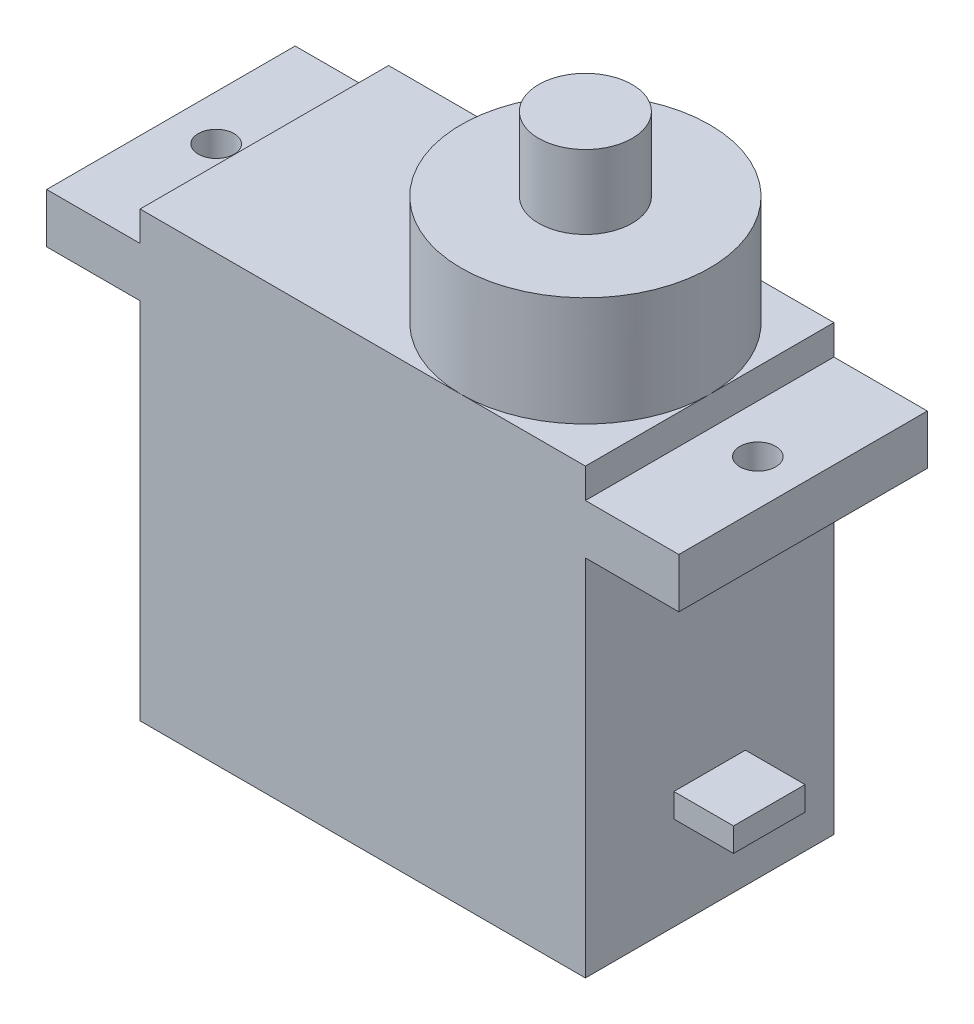
ISO-10303-21;
HEADER;
FILE_DESCRIPTION(('STEP AP214'),'2;1');
FILE_NAME('part.step','',(''),(''),'','','');
FILE_SCHEMA(('AUTOMOTIVE_DESIGN { 1 0 10303 214 1 1 1 1 }'));
ENDSEC;
DATA;
#1=APPLICATION_CONTEXT('core data for automotive mechanical design processes');
#2=APPLICATION_PROTOCOL_DEFINITION('international standard','automotive_design',2000,#1);
#3=PRODUCT_CONTEXT('',#1,'mechanical');
#4=PRODUCT('Part','Part','',(#3));
#5=PRODUCT_RELATED_PRODUCT_CATEGORY('part','',(#4));
#6=PRODUCT_DEFINITION_FORMATION('','',#4);
#7=PRODUCT_DEFINITION_CONTEXT('part definition',#1,'design');
#8=PRODUCT_DEFINITION('design','',#6,#7);
#9=PRODUCT_DEFINITION_SHAPE('','',#8);
#10=(LENGTH_UNIT() NAMED_UNIT(*) SI_UNIT(.MILLI.,.METRE.));
#11=(NAMED_UNIT(*) PLANE_ANGLE_UNIT() SI_UNIT($,.RADIAN.));
#12=(NAMED_UNIT(*) SI_UNIT($,.STERADIAN.) SOLID_ANGLE_UNIT());
#13=UNCERTAINTY_MEASURE_WITH_UNIT(LENGTH_MEASURE(1.E-05),#10,'distance_accuracy_value','');
#14=(GEOMETRIC_REPRESENTATION_CONTEXT(3) GLOBAL_UNCERTAINTY_ASSIGNED_CONTEXT((#13)) GLOBAL_UNIT_ASSIGNED_CONTEXT((#10,
#11,#12)) REPRESENTATION_CONTEXT('',''));
#15=CARTESIAN_POINT('',(0.,0.,0.));
#16=DIRECTION('',(0.,0.,1.));
#17=DIRECTION('',(1.,0.,0.));
#18=AXIS2_PLACEMENT_3D('',#15,#16,#17);
#19=CARTESIAN_POINT('',(22.4,0.,12.5));
#20=DIRECTION('',(-1.,0.,0.));
#21=DIRECTION('',(0.,0.,1.));
#22=AXIS2_PLACEMENT_3D('',#19,#20,#21);
#23=PLANE('',#22);
#24=DIRECTION('',(0.,0.,-1.));
#25=VECTOR('',#24,1.);
#26=CARTESIAN_POINT('',(22.4,18.3,12.5));
#27=LINE('',#26,#25);
#28=CARTESIAN_POINT('',(22.4,18.3,12.5));
#29=VERTEX_POINT('',#28);
#30=CARTESIAN_POINT('',(22.4,18.3,0.));
#31=VERTEX_POINT('',#30);
#32=EDGE_CURVE('E229',#29,#31,#27,.T.);
#33=ORIENTED_EDGE('',*,*,#32,.F.);
#34=DIRECTION('',(0.,1.,0.));
#35=VECTOR('',#34,1.);
#36=CARTESIAN_POINT('',(22.4,0.,12.5));
#37=LINE('',#36,#35);
#38=CARTESIAN_POINT('',(22.4,0.,12.5));
#39=VERTEX_POINT('',#38);
#40=EDGE_CURVE('E274',#39,#29,#37,.T.);
#41=ORIENTED_EDGE('',*,*,#40,.F.);
#42=DIRECTION('',(0.,0.,-1.));
#43=VECTOR('',#42,1.);
#44=CARTESIAN_POINT('',(22.4,0.,12.5));
#45=LINE('',#44,#43);
#46=CARTESIAN_POINT('',(22.4,0.,0.));
#47=VERTEX_POINT('',#46);
#48=EDGE_CURVE('E297',#39,#47,#45,.T.);
#49=ORIENTED_EDGE('',*,*,#48,.T.);
#50=DIRECTION('',(0.,1.,0.));
#51=VECTOR('',#50,1.);
#52=CARTESIAN_POINT('',(22.4,0.,0.));
#53=LINE('',#52,#51);
#54=EDGE_CURVE('E286',#47,#31,#53,.T.);
#55=ORIENTED_EDGE('',*,*,#54,.T.);
#56=EDGE_LOOP('',(#33,#41,#49,#55));
#57=FACE_BOUND('',#56,.T.);
#58=DIRECTION('',(0.,1.,0.));
#59=VECTOR('',#58,1.);
#60=CARTESIAN_POINT('',(22.4,5.9,4.45));
#61=LINE('',#60,#59);
#62=CARTESIAN_POINT('',(22.4,4.7,4.45));
#63=VERTEX_POINT('',#62);
#64=CARTESIAN_POINT('',(22.4,5.9,4.45));
#65=VERTEX_POINT('',#64);
#66=EDGE_CURVE('E184',#63,#65,#61,.T.);
#67=ORIENTED_EDGE('',*,*,#66,.F.);
#68=DIRECTION('',(0.,0.,-1.));
#69=VECTOR('',#68,1.);
#70=CARTESIAN_POINT('',(22.4,4.7,8.05));
#71=LINE('',#70,#69);
#72=CARTESIAN_POINT('',(22.4,4.7,8.05));
#73=VERTEX_POINT('',#72);
#74=EDGE_CURVE('E181',#73,#63,#71,.T.);
#75=ORIENTED_EDGE('',*,*,#74,.F.);
#76=DIRECTION('',(0.,-1.,0.));
#77=VECTOR('',#76,1.);
#78=CARTESIAN_POINT('',(22.4,5.9,8.05));
#79=LINE('',#78,#77);
#80=CARTESIAN_POINT('',(22.4,5.9,8.05));
#81=VERTEX_POINT('',#80);
#82=EDGE_CURVE('E62',#81,#73,#79,.T.);
#83=ORIENTED_EDGE('',*,*,#82,.F.);
#84=DIRECTION('',(0.,0.,1.));
#85=VECTOR('',#84,1.);
#86=CARTESIAN_POINT('',(22.4,5.9,8.05));
#87=LINE('',#86,#85);
#88=EDGE_CURVE('E57',#65,#81,#87,.T.);
#89=ORIENTED_EDGE('',*,*,#88,.F.);
#90=EDGE_LOOP('',(#67,#75,#83,#89));
#91=FACE_BOUND('',#90,.T.);
#92=ADVANCED_FACE('F40',(#57,#91),#23,.F.);
#93=CARTESIAN_POINT('',(0.,0.,12.5));
#94=DIRECTION('',(1.,0.,0.));
#95=DIRECTION('',(0.,0.,-1.));
#96=AXIS2_PLACEMENT_3D('',#93,#94,#95);
#97=PLANE('',#96);
#98=DIRECTION('',(0.,0.,-1.));
#99=VECTOR('',#98,1.);
#100=CARTESIAN_POINT('',(0.,20.8,0.));
#101=LINE('',#100,#99);
#102=CARTESIAN_POINT('',(0.,20.8,12.5));
#103=VERTEX_POINT('',#102);
#104=CARTESIAN_POINT('',(0.,20.8,0.));
#105=VERTEX_POINT('',#104);
#106=EDGE_CURVE('E207',#103,#105,#101,.T.);
#107=ORIENTED_EDGE('',*,*,#106,.F.);
#108=DIRECTION('',(0.,-1.,0.));
#109=VECTOR('',#108,1.);
#110=CARTESIAN_POINT('',(0.,0.,12.5));
#111=LINE('',#110,#109);
#112=CARTESIAN_POINT('',(0.,22.3,12.5));
#113=VERTEX_POINT('',#112);
#114=EDGE_CURVE('E267',#113,#103,#111,.T.);
#115=ORIENTED_EDGE('',*,*,#114,.F.);
#116=DIRECTION('',(0.,0.,-1.));
#117=VECTOR('',#116,1.);
#118=CARTESIAN_POINT('',(0.,22.3,12.5));
#119=LINE('',#118,#117);
#120=CARTESIAN_POINT('',(0.,22.3,0.));
#121=VERTEX_POINT('',#120);
#122=EDGE_CURVE('E280',#113,#121,#119,.T.);
#123=ORIENTED_EDGE('',*,*,#122,.T.);
#124=DIRECTION('',(0.,-1.,0.));
#125=VECTOR('',#124,1.);
#126=CARTESIAN_POINT('',(0.,0.,0.));
#127=LINE('',#126,#125);
#128=EDGE_CURVE('E281',#121,#105,#127,.T.);
#129=ORIENTED_EDGE('',*,*,#128,.T.);
#130=EDGE_LOOP('',(#107,#115,#123,#129));
#131=FACE_BOUND('',#130,.T.);
#132=ADVANCED_FACE('F42',(#131),#97,.F.);
#133=DIRECTION('',(0.,0.,1.));
#134=VECTOR('',#133,1.);
#135=CARTESIAN_POINT('',(0.,18.3,0.));
#136=LINE('',#135,#134);
#137=CARTESIAN_POINT('',(0.,18.3,0.));
#138=VERTEX_POINT('',#137);
#139=CARTESIAN_POINT('',(0.,18.3,12.5));
#140=VERTEX_POINT('',#139);
#141=EDGE_CURVE('E202',#138,#140,#136,.T.);
#142=ORIENTED_EDGE('',*,*,#141,.F.);
#143=CARTESIAN_POINT('',(0.,0.,0.));
#144=VERTEX_POINT('',#143);
#145=EDGE_CURVE('E263',#138,#144,#127,.T.);
#146=ORIENTED_EDGE('',*,*,#145,.T.);
#147=DIRECTION('',(0.,0.,-1.));
#148=VECTOR('',#147,1.);
#149=CARTESIAN_POINT('',(0.,0.,12.5));
#150=LINE('',#149,#148);
#151=CARTESIAN_POINT('',(0.,0.,12.5));
#152=VERTEX_POINT('',#151);
#153=EDGE_CURVE('E44',#152,#144,#150,.T.);
#154=ORIENTED_EDGE('',*,*,#153,.F.);
#155=EDGE_CURVE('E271',#140,#152,#111,.T.);
#156=ORIENTED_EDGE('',*,*,#155,.F.);
#157=EDGE_LOOP('',(#142,#146,#154,#156));
#158=FACE_BOUND('',#157,.T.);
#159=ADVANCED_FACE('F349',(#158),#97,.F.);
#160=DIRECTION('',(0.,0.,1.));
#161=VECTOR('',#160,1.);
#162=CARTESIAN_POINT('',(22.4,20.8,12.5));
#163=LINE('',#162,#161);
#164=CARTESIAN_POINT('',(22.4,20.8,0.));
#165=VERTEX_POINT('',#164);
#166=CARTESIAN_POINT('',(22.4,20.8,12.5));
#167=VERTEX_POINT('',#166);
#168=EDGE_CURVE('E234',#165,#167,#163,.T.);
#169=ORIENTED_EDGE('',*,*,#168,.F.);
#170=CARTESIAN_POINT('',(22.4,22.3,0.));
#171=VERTEX_POINT('',#170);
#172=EDGE_CURVE('E285',#165,#171,#53,.T.);
#173=ORIENTED_EDGE('',*,*,#172,.T.);
#174=DIRECTION('',(0.,0.,-1.));
#175=VECTOR('',#174,1.);
#176=CARTESIAN_POINT('',(22.4,22.3,12.5));
#177=LINE('',#176,#175);
#178=CARTESIAN_POINT('',(22.4,22.3,6.25));
#179=VERTEX_POINT('',#178);
#180=EDGE_CURVE('E294',#179,#171,#177,.T.);
#181=ORIENTED_EDGE('',*,*,#180,.F.);
#182=CARTESIAN_POINT('',(22.4,22.3,12.5));
#183=VERTEX_POINT('',#182);
#184=EDGE_CURVE('E295',#183,#179,#177,.T.);
#185=ORIENTED_EDGE('',*,*,#184,.F.);
#186=EDGE_CURVE('E273',#167,#183,#37,.T.);
#187=ORIENTED_EDGE('',*,*,#186,.F.);
#188=EDGE_LOOP('',(#169,#173,#181,#185,#187));
#189=FACE_BOUND('',#188,.T.);
#190=ADVANCED_FACE('F320',(#189),#23,.F.);
#191=CARTESIAN_POINT('',(0.,22.3,12.5));
#192=DIRECTION('',(0.,-1.,0.));
#193=DIRECTION('',(0.,0.,-1.));
#194=AXIS2_PLACEMENT_3D('',#191,#192,#193);
#195=PLANE('',#194);
#196=CARTESIAN_POINT('',(16.15,22.3,6.25));
#197=DIRECTION('',(0.,1.,0.));
#198=DIRECTION('',(0.,0.,1.));
#199=AXIS2_PLACEMENT_3D('',#196,#197,#198);
#200=CIRCLE('',#199,6.25);
#201=CARTESIAN_POINT('',(16.15,22.3,12.5));
#202=VERTEX_POINT('',#201);
#203=EDGE_CURVE('E258',#202,#179,#200,.T.);
#204=ORIENTED_EDGE('',*,*,#203,.F.);
#205=DIRECTION('',(-1.,0.,0.));
#206=VECTOR('',#205,1.);
#207=CARTESIAN_POINT('',(0.,22.3,12.5));
#208=LINE('',#207,#206);
#209=EDGE_CURVE('E278',#183,#202,#208,.T.);
#210=ORIENTED_EDGE('',*,*,#209,.F.);
#211=ORIENTED_EDGE('',*,*,#184,.T.);
#212=EDGE_LOOP('',(#204,#210,#211));
#213=FACE_BOUND('',#212,.T.);
#214=ADVANCED_FACE('F323',(#213),#195,.F.);
#215=CARTESIAN_POINT('',(16.15,22.3,0.));
#216=VERTEX_POINT('',#215);
#217=EDGE_CURVE('E49',#179,#216,#200,.T.);
#218=ORIENTED_EDGE('',*,*,#217,.F.);
#219=ORIENTED_EDGE('',*,*,#180,.T.);
#220=DIRECTION('',(-1.,0.,0.));
#221=VECTOR('',#220,1.);
#222=CARTESIAN_POINT('',(0.,22.3,0.));
#223=LINE('',#222,#221);
#224=EDGE_CURVE('E289',#171,#216,#223,.T.);
#225=ORIENTED_EDGE('',*,*,#224,.T.);
#226=EDGE_LOOP('',(#218,#219,#225));
#227=FACE_BOUND('',#226,.T.);
#228=ADVANCED_FACE('F315',(#227),#195,.F.);
#229=CARTESIAN_POINT('',(0.,0.,12.5));
#230=DIRECTION('',(0.,1.,0.));
#231=DIRECTION('',(0.,0.,1.));
#232=AXIS2_PLACEMENT_3D('',#229,#230,#231);
#233=PLANE('',#232);
#234=DIRECTION('',(1.,0.,0.));
#235=VECTOR('',#234,1.);
#236=CARTESIAN_POINT('',(0.,0.,0.));
#237=LINE('',#236,#235);
#238=EDGE_CURVE('E283',#144,#47,#237,.T.);
#239=ORIENTED_EDGE('',*,*,#238,.T.);
#240=ORIENTED_EDGE('',*,*,#48,.F.);
#241=DIRECTION('',(1.,0.,0.));
#242=VECTOR('',#241,1.);
#243=CARTESIAN_POINT('',(0.,0.,12.5));
#244=LINE('',#243,#242);
#245=EDGE_CURVE('E270',#152,#39,#244,.T.);
#246=ORIENTED_EDGE('',*,*,#245,.F.);
#247=ORIENTED_EDGE('',*,*,#153,.T.);
#248=EDGE_LOOP('',(#239,#240,#246,#247));
#249=FACE_BOUND('',#248,.T.);
#250=ADVANCED_FACE('F353',(#249),#233,.F.);
#251=EDGE_CURVE('E266',#216,#202,#200,.T.);
#252=ORIENTED_EDGE('',*,*,#251,.F.);
#253=EDGE_CURVE('E288',#216,#121,#223,.T.);
#254=ORIENTED_EDGE('',*,*,#253,.T.);
#255=ORIENTED_EDGE('',*,*,#122,.F.);
#256=EDGE_CURVE('E277',#202,#113,#208,.T.);
#257=ORIENTED_EDGE('',*,*,#256,.F.);
#258=EDGE_LOOP('',(#252,#254,#255,#257));
#259=FACE_BOUND('',#258,.T.);
#260=ADVANCED_FACE('F329',(#259),#195,.F.);
#261=CARTESIAN_POINT('',(0.,0.,12.5));
#262=DIRECTION('',(0.,0.,-1.));
#263=DIRECTION('',(-1.,0.,0.));
#264=AXIS2_PLACEMENT_3D('',#261,#262,#263);
#265=PLANE('',#264);
#266=ORIENTED_EDGE('',*,*,#114,.T.);
#267=DIRECTION('',(1.,0.,0.));
#268=VECTOR('',#267,1.);
#269=CARTESIAN_POINT('',(-4.7,20.8,12.5));
#270=LINE('',#269,#268);
#271=CARTESIAN_POINT('',(-4.7,20.8,12.5));
#272=VERTEX_POINT('',#271);
#273=EDGE_CURVE('E220',#272,#103,#270,.T.);
#274=ORIENTED_EDGE('',*,*,#273,.F.);
#275=DIRECTION('',(0.,1.,0.));
#276=VECTOR('',#275,1.);
#277=CARTESIAN_POINT('',(-4.7,18.3,12.5));
#278=LINE('',#277,#276);
#279=CARTESIAN_POINT('',(-4.7,18.3,12.5));
#280=VERTEX_POINT('',#279);
#281=EDGE_CURVE('E209',#280,#272,#278,.T.);
#282=ORIENTED_EDGE('',*,*,#281,.F.);
#283=DIRECTION('',(1.,0.,0.));
#284=VECTOR('',#283,1.);
#285=CARTESIAN_POINT('',(-4.7,18.3,12.5));
#286=LINE('',#285,#284);
#287=EDGE_CURVE('E223',#280,#140,#286,.T.);
#288=ORIENTED_EDGE('',*,*,#287,.T.);
#289=ORIENTED_EDGE('',*,*,#155,.T.);
#290=ORIENTED_EDGE('',*,*,#245,.T.);
#291=ORIENTED_EDGE('',*,*,#40,.T.);
#292=DIRECTION('',(-1.,0.,0.));
#293=VECTOR('',#292,1.);
#294=CARTESIAN_POINT('',(27.1,18.3,12.5));
#295=LINE('',#294,#293);
#296=CARTESIAN_POINT('',(27.1,18.3,12.5));
#297=VERTEX_POINT('',#296);
#298=EDGE_CURVE('E253',#297,#29,#295,.T.);
#299=ORIENTED_EDGE('',*,*,#298,.F.);
#300=DIRECTION('',(0.,-1.,0.));
#301=VECTOR('',#300,1.);
#302=CARTESIAN_POINT('',(27.1,18.3,12.5));
#303=LINE('',#302,#301);
#304=CARTESIAN_POINT('',(27.1,20.8,12.5));
#305=VERTEX_POINT('',#304);
#306=EDGE_CURVE('E230',#305,#297,#303,.T.);
#307=ORIENTED_EDGE('',*,*,#306,.F.);
#308=DIRECTION('',(-1.,0.,0.));
#309=VECTOR('',#308,1.);
#310=CARTESIAN_POINT('',(27.1,20.8,12.5));
#311=LINE('',#310,#309);
#312=EDGE_CURVE('E240',#305,#167,#311,.T.);
#313=ORIENTED_EDGE('',*,*,#312,.T.);
#314=ORIENTED_EDGE('',*,*,#186,.T.);
#315=ORIENTED_EDGE('',*,*,#209,.T.);
#316=ORIENTED_EDGE('',*,*,#256,.T.);
#317=EDGE_LOOP('',(#266,#274,#282,#288,#289,#290,#291,#299,#307,#313,#314,#315,#316));
#318=FACE_BOUND('',#317,.T.);
#319=ADVANCED_FACE('F326',(#318),#265,.F.);
#320=CARTESIAN_POINT('',(0.,0.,0.));
#321=DIRECTION('',(0.,0.,-1.));
#322=DIRECTION('',(-1.,0.,0.));
#323=AXIS2_PLACEMENT_3D('',#320,#321,#322);
#324=PLANE('',#323);
#325=ORIENTED_EDGE('',*,*,#128,.F.);
#326=ORIENTED_EDGE('',*,*,#253,.F.);
#327=ORIENTED_EDGE('',*,*,#224,.F.);
#328=ORIENTED_EDGE('',*,*,#172,.F.);
#329=DIRECTION('',(-1.,0.,0.));
#330=VECTOR('',#329,1.);
#331=CARTESIAN_POINT('',(27.1,20.8,0.));
#332=LINE('',#331,#330);
#333=CARTESIAN_POINT('',(27.1,20.8,0.));
#334=VERTEX_POINT('',#333);
#335=EDGE_CURVE('E247',#334,#165,#332,.T.);
#336=ORIENTED_EDGE('',*,*,#335,.F.);
#337=DIRECTION('',(0.,1.,0.));
#338=VECTOR('',#337,1.);
#339=CARTESIAN_POINT('',(27.1,18.3,0.));
#340=LINE('',#339,#338);
#341=CARTESIAN_POINT('',(27.1,18.3,0.));
#342=VERTEX_POINT('',#341);
#343=EDGE_CURVE('E236',#342,#334,#340,.T.);
#344=ORIENTED_EDGE('',*,*,#343,.F.);
#345=DIRECTION('',(-1.,0.,0.));
#346=VECTOR('',#345,1.);
#347=CARTESIAN_POINT('',(27.1,18.3,0.));
#348=LINE('',#347,#346);
#349=EDGE_CURVE('E250',#342,#31,#348,.T.);
#350=ORIENTED_EDGE('',*,*,#349,.T.);
#351=ORIENTED_EDGE('',*,*,#54,.F.);
#352=ORIENTED_EDGE('',*,*,#238,.F.);
#353=ORIENTED_EDGE('',*,*,#145,.F.);
#354=DIRECTION('',(1.,0.,0.));
#355=VECTOR('',#354,1.);
#356=CARTESIAN_POINT('',(-4.7,18.3,0.));
#357=LINE('',#356,#355);
#358=CARTESIAN_POINT('',(-4.7,18.3,0.));
#359=VERTEX_POINT('',#358);
#360=EDGE_CURVE('E226',#359,#138,#357,.T.);
#361=ORIENTED_EDGE('',*,*,#360,.F.);
#362=DIRECTION('',(0.,-1.,0.));
#363=VECTOR('',#362,1.);
#364=CARTESIAN_POINT('',(-4.7,18.3,0.));
#365=LINE('',#364,#363);
#366=CARTESIAN_POINT('',(-4.7,20.8,0.));
#367=VERTEX_POINT('',#366);
#368=EDGE_CURVE('E203',#367,#359,#365,.T.);
#369=ORIENTED_EDGE('',*,*,#368,.F.);
#370=DIRECTION('',(1.,0.,0.));
#371=VECTOR('',#370,1.);
#372=CARTESIAN_POINT('',(-4.7,20.8,0.));
#373=LINE('',#372,#371);
#374=EDGE_CURVE('E213',#367,#105,#373,.T.);
#375=ORIENTED_EDGE('',*,*,#374,.T.);
#376=EDGE_LOOP('',(#325,#326,#327,#328,#336,#344,#350,#351,#352,#353,#361,#369,#375));
#377=FACE_BOUND('',#376,.T.);
#378=ADVANCED_FACE('F352',(#377),#324,.T.);
#379=CARTESIAN_POINT('',(16.15,27.8,6.25));
#380=DIRECTION('',(0.,-1.,0.));
#381=DIRECTION('',(0.,0.,-1.));
#382=AXIS2_PLACEMENT_3D('',#379,#380,#381);
#383=CYLINDRICAL_SURFACE('',#382,6.25);
#384=CARTESIAN_POINT('',(16.15,27.8,6.25));
#385=DIRECTION('',(0.,1.,0.));
#386=DIRECTION('',(0.,0.,1.));
#387=AXIS2_PLACEMENT_3D('',#384,#385,#386);
#388=CIRCLE('',#387,6.25);
#389=CARTESIAN_POINT('',(16.15,27.8,12.5));
#390=VERTEX_POINT('',#389);
#391=EDGE_CURVE('E260',#390,#390,#388,.T.);
#392=ORIENTED_EDGE('',*,*,#391,.F.);
#393=EDGE_LOOP('',(#392));
#394=FACE_BOUND('',#393,.T.);
#395=ORIENTED_EDGE('',*,*,#203,.T.);
#396=ORIENTED_EDGE('',*,*,#217,.T.);
#397=ORIENTED_EDGE('',*,*,#251,.T.);
#398=EDGE_LOOP('',(#395,#396,#397));
#399=FACE_BOUND('',#398,.T.);
#400=ADVANCED_FACE('F310',(#394,#399),#383,.T.);
#401=CARTESIAN_POINT('',(16.15,27.8,6.25));
#402=DIRECTION('',(0.,1.,0.));
#403=DIRECTION('',(0.,0.,1.));
#404=AXIS2_PLACEMENT_3D('',#401,#402,#403);
#405=PLANE('',#404);
#406=CARTESIAN_POINT('',(16.15,27.8,6.25));
#407=DIRECTION('',(0.,1.,0.));
#408=DIRECTION('',(0.,0.,1.));
#409=AXIS2_PLACEMENT_3D('',#406,#407,#408);
#410=CIRCLE('',#409,2.35);
#411=CARTESIAN_POINT('',(16.15,27.8,8.6));
#412=VERTEX_POINT('',#411);
#413=EDGE_CURVE('E11',#412,#412,#410,.T.);
#414=ORIENTED_EDGE('',*,*,#413,.F.);
#415=EDGE_LOOP('',(#414));
#416=FACE_BOUND('',#415,.T.);
#417=ORIENTED_EDGE('',*,*,#391,.T.);
#418=EDGE_LOOP('',(#417));
#419=FACE_BOUND('',#418,.T.);
#420=ADVANCED_FACE('F432',(#416,#419),#405,.T.);
#421=CARTESIAN_POINT('',(16.15,31.5,6.25));
#422=DIRECTION('',(0.,-1.,0.));
#423=DIRECTION('',(0.,0.,-1.));
#424=AXIS2_PLACEMENT_3D('',#421,#422,#423);
#425=CYLINDRICAL_SURFACE('',#424,2.35);
#426=CARTESIAN_POINT('',(16.15,31.5,6.25));
#427=DIRECTION('',(0.,1.,0.));
#428=DIRECTION('',(0.,0.,1.));
#429=AXIS2_PLACEMENT_3D('',#426,#427,#428);
#430=CIRCLE('',#429,2.35);
#431=CARTESIAN_POINT('',(16.15,31.5,8.6));
#432=VERTEX_POINT('',#431);
#433=EDGE_CURVE('E256',#432,#432,#430,.T.);
#434=ORIENTED_EDGE('',*,*,#433,.F.);
#435=EDGE_LOOP('',(#434));
#436=FACE_BOUND('',#435,.T.);
#437=ORIENTED_EDGE('',*,*,#413,.T.);
#438=EDGE_LOOP('',(#437));
#439=FACE_BOUND('',#438,.T.);
#440=ADVANCED_FACE('F421',(#436,#439),#425,.T.);
#441=CARTESIAN_POINT('',(16.15,31.5,6.25));
#442=DIRECTION('',(0.,1.,0.));
#443=DIRECTION('',(0.,0.,1.));
#444=AXIS2_PLACEMENT_3D('',#441,#442,#443);
#445=PLANE('',#444);
#446=ORIENTED_EDGE('',*,*,#433,.T.);
#447=EDGE_LOOP('',(#446));
#448=FACE_BOUND('',#447,.T.);
#449=ADVANCED_FACE('F375',(#448),#445,.T.);
#450=CARTESIAN_POINT('',(27.1,18.3,12.5));
#451=DIRECTION('',(0.,1.,0.));
#452=DIRECTION('',(0.,0.,1.));
#453=AXIS2_PLACEMENT_3D('',#450,#451,#452);
#454=PLANE('',#453);
#455=CARTESIAN_POINT('',(24.8220091230081,18.3,6.25));
#456=DIRECTION('',(0.,1.,0.));
#457=DIRECTION('',(0.,0.,1.));
#458=AXIS2_PLACEMENT_3D('',#455,#456,#457);
#459=CIRCLE('',#458,0.9);
#460=CARTESIAN_POINT('',(24.8220091230081,18.3,7.15));
#461=VERTEX_POINT('',#460);
#462=EDGE_CURVE('E199',#461,#461,#459,.T.);
#463=ORIENTED_EDGE('',*,*,#462,.T.);
#464=EDGE_LOOP('',(#463));
#465=FACE_BOUND('',#464,.T.);
#466=ORIENTED_EDGE('',*,*,#32,.T.);
#467=ORIENTED_EDGE('',*,*,#349,.F.);
#468=DIRECTION('',(0.,0.,-1.));
#469=VECTOR('',#468,1.);
#470=CARTESIAN_POINT('',(27.1,18.3,12.5));
#471=LINE('',#470,#469);
#472=EDGE_CURVE('E233',#297,#342,#471,.T.);
#473=ORIENTED_EDGE('',*,*,#472,.F.);
#474=ORIENTED_EDGE('',*,*,#298,.T.);
#475=EDGE_LOOP('',(#466,#467,#473,#474));
#476=FACE_BOUND('',#475,.T.);
#477=ADVANCED_FACE('F357',(#465,#476),#454,.F.);
#478=CARTESIAN_POINT('',(27.1,20.8,12.5));
#479=DIRECTION('',(0.,-1.,0.));
#480=DIRECTION('',(0.,0.,-1.));
#481=AXIS2_PLACEMENT_3D('',#478,#479,#480);
#482=PLANE('',#481);
#483=CARTESIAN_POINT('',(24.8220091230081,20.8,6.25));
#484=DIRECTION('',(0.,1.,0.));
#485=DIRECTION('',(0.,0.,-1.));
#486=AXIS2_PLACEMENT_3D('',#483,#484,#485);
#487=CIRCLE('',#486,0.9);
#488=CARTESIAN_POINT('',(24.8220091230081,20.8,5.35));
#489=VERTEX_POINT('',#488);
#490=EDGE_CURVE('E185',#489,#489,#487,.T.);
#491=ORIENTED_EDGE('',*,*,#490,.F.);
#492=EDGE_LOOP('',(#491));
#493=FACE_BOUND('',#492,.T.);
#494=ORIENTED_EDGE('',*,*,#168,.T.);
#495=ORIENTED_EDGE('',*,*,#312,.F.);
#496=DIRECTION('',(0.,0.,1.));
#497=VECTOR('',#496,1.);
#498=CARTESIAN_POINT('',(27.1,20.8,12.5));
#499=LINE('',#498,#497);
#500=EDGE_CURVE('E238',#334,#305,#499,.T.);
#501=ORIENTED_EDGE('',*,*,#500,.F.);
#502=ORIENTED_EDGE('',*,*,#335,.T.);
#503=EDGE_LOOP('',(#494,#495,#501,#502));
#504=FACE_BOUND('',#503,.T.);
#505=ADVANCED_FACE('F365',(#493,#504),#482,.F.);
#506=CARTESIAN_POINT('',(27.1,0.,0.));
#507=DIRECTION('',(-1.,0.,0.));
#508=DIRECTION('',(0.,0.,1.));
#509=AXIS2_PLACEMENT_3D('',#506,#507,#508);
#510=PLANE('',#509);
#511=ORIENTED_EDGE('',*,*,#306,.T.);
#512=ORIENTED_EDGE('',*,*,#472,.T.);
#513=ORIENTED_EDGE('',*,*,#343,.T.);
#514=ORIENTED_EDGE('',*,*,#500,.T.);
#515=EDGE_LOOP('',(#511,#512,#513,#514));
#516=FACE_BOUND('',#515,.T.);
#517=ADVANCED_FACE('F361',(#516),#510,.F.);
#518=CARTESIAN_POINT('',(-4.7,18.3,0.));
#519=DIRECTION('',(0.,1.,0.));
#520=DIRECTION('',(0.,0.,1.));
#521=AXIS2_PLACEMENT_3D('',#518,#519,#520);
#522=PLANE('',#521);
#523=CARTESIAN_POINT('',(-2.42200912300813,18.3,6.25));
#524=DIRECTION('',(0.,1.,0.));
#525=DIRECTION('',(0.,0.,1.));
#526=AXIS2_PLACEMENT_3D('',#523,#524,#525);
#527=CIRCLE('',#526,0.9);
#528=CARTESIAN_POINT('',(-2.42200912300813,18.3,7.15));
#529=VERTEX_POINT('',#528);
#530=EDGE_CURVE('E195',#529,#529,#527,.T.);
#531=ORIENTED_EDGE('',*,*,#530,.T.);
#532=EDGE_LOOP('',(#531));
#533=FACE_BOUND('',#532,.T.);
#534=ORIENTED_EDGE('',*,*,#141,.T.);
#535=ORIENTED_EDGE('',*,*,#287,.F.);
#536=DIRECTION('',(0.,0.,1.));
#537=VECTOR('',#536,1.);
#538=CARTESIAN_POINT('',(-4.7,18.3,0.));
#539=LINE('',#538,#537);
#540=EDGE_CURVE('E206',#359,#280,#539,.T.);
#541=ORIENTED_EDGE('',*,*,#540,.F.);
#542=ORIENTED_EDGE('',*,*,#360,.T.);
#543=EDGE_LOOP('',(#534,#535,#541,#542));
#544=FACE_BOUND('',#543,.T.);
#545=ADVANCED_FACE('F346',(#533,#544),#522,.F.);
#546=CARTESIAN_POINT('',(-4.7,20.8,0.));
#547=DIRECTION('',(0.,-1.,0.));
#548=DIRECTION('',(0.,0.,-1.));
#549=AXIS2_PLACEMENT_3D('',#546,#547,#548);
#550=PLANE('',#549);
#551=CARTESIAN_POINT('',(-2.42200912300813,20.8,6.25));
#552=DIRECTION('',(0.,1.,0.));
#553=DIRECTION('',(0.,0.,1.));
#554=AXIS2_PLACEMENT_3D('',#551,#552,#553);
#555=CIRCLE('',#554,0.9);
#556=CARTESIAN_POINT('',(-2.42200912300813,20.8,7.15));
#557=VERTEX_POINT('',#556);
#558=EDGE_CURVE('E188',#557,#557,#555,.T.);
#559=ORIENTED_EDGE('',*,*,#558,.F.);
#560=EDGE_LOOP('',(#559));
#561=FACE_BOUND('',#560,.T.);
#562=ORIENTED_EDGE('',*,*,#106,.T.);
#563=ORIENTED_EDGE('',*,*,#374,.F.);
#564=DIRECTION('',(0.,0.,-1.));
#565=VECTOR('',#564,1.);
#566=CARTESIAN_POINT('',(-4.7,20.8,0.));
#567=LINE('',#566,#565);
#568=EDGE_CURVE('E211',#272,#367,#567,.T.);
#569=ORIENTED_EDGE('',*,*,#568,.F.);
#570=ORIENTED_EDGE('',*,*,#273,.T.);
#571=EDGE_LOOP('',(#562,#563,#569,#570));
#572=FACE_BOUND('',#571,.T.);
#573=ADVANCED_FACE('F338',(#561,#572),#550,.F.);
#574=CARTESIAN_POINT('',(-4.7,0.,0.));
#575=DIRECTION('',(1.,0.,0.));
#576=DIRECTION('',(0.,0.,-1.));
#577=AXIS2_PLACEMENT_3D('',#574,#575,#576);
#578=PLANE('',#577);
#579=ORIENTED_EDGE('',*,*,#368,.T.);
#580=ORIENTED_EDGE('',*,*,#540,.T.);
#581=ORIENTED_EDGE('',*,*,#281,.T.);
#582=ORIENTED_EDGE('',*,*,#568,.T.);
#583=EDGE_LOOP('',(#579,#580,#581,#582));
#584=FACE_BOUND('',#583,.T.);
#585=ADVANCED_FACE('F342',(#584),#578,.F.);
#586=CARTESIAN_POINT('',(-2.42200912300813,16.1,6.25));
#587=DIRECTION('',(0.,1.,0.));
#588=DIRECTION('',(0.,0.,1.));
#589=AXIS2_PLACEMENT_3D('',#586,#587,#588);
#590=CYLINDRICAL_SURFACE('',#589,0.9);
#591=ORIENTED_EDGE('',*,*,#558,.T.);
#592=EDGE_LOOP('',(#591));
#593=FACE_BOUND('',#592,.T.);
#594=ORIENTED_EDGE('',*,*,#530,.F.);
#595=EDGE_LOOP('',(#594));
#596=FACE_BOUND('',#595,.T.);
#597=ADVANCED_FACE('F529',(#593,#596),#590,.F.);
#598=CARTESIAN_POINT('',(24.8220091230081,16.1,6.25));
#599=DIRECTION('',(0.,1.,0.));
#600=DIRECTION('',(0.,0.,1.));
#601=AXIS2_PLACEMENT_3D('',#598,#599,#600);
#602=CYLINDRICAL_SURFACE('',#601,0.9);
#603=ORIENTED_EDGE('',*,*,#490,.T.);
#604=EDGE_LOOP('',(#603));
#605=FACE_BOUND('',#604,.T.);
#606=ORIENTED_EDGE('',*,*,#462,.F.);
#607=EDGE_LOOP('',(#606));
#608=FACE_BOUND('',#607,.T.);
#609=ADVANCED_FACE('F537',(#605,#608),#602,.F.);
#610=CARTESIAN_POINT('',(25.4,5.9,4.45));
#611=DIRECTION('',(0.,0.,1.));
#612=DIRECTION('',(1.,0.,0.));
#613=AXIS2_PLACEMENT_3D('',#610,#611,#612);
#614=PLANE('',#613);
#615=ORIENTED_EDGE('',*,*,#66,.T.);
#616=DIRECTION('',(-1.,0.,0.));
#617=VECTOR('',#616,1.);
#618=CARTESIAN_POINT('',(25.4,5.9,4.45));
#619=LINE('',#618,#617);
#620=CARTESIAN_POINT('',(25.4,5.9,4.45));
#621=VERTEX_POINT('',#620);
#622=EDGE_CURVE('E165',#621,#65,#619,.T.);
#623=ORIENTED_EDGE('',*,*,#622,.F.);
#624=DIRECTION('',(0.,1.,0.));
#625=VECTOR('',#624,1.);
#626=CARTESIAN_POINT('',(25.4,5.9,4.45));
#627=LINE('',#626,#625);
#628=CARTESIAN_POINT('',(25.4,4.7,4.45));
#629=VERTEX_POINT('',#628);
#630=EDGE_CURVE('E172',#629,#621,#627,.T.);
#631=ORIENTED_EDGE('',*,*,#630,.F.);
#632=DIRECTION('',(-1.,0.,0.));
#633=VECTOR('',#632,1.);
#634=CARTESIAN_POINT('',(25.4,4.7,4.45));
#635=LINE('',#634,#633);
#636=EDGE_CURVE('E603',#629,#63,#635,.T.);
#637=ORIENTED_EDGE('',*,*,#636,.T.);
#638=EDGE_LOOP('',(#615,#623,#631,#637));
#639=FACE_BOUND('',#638,.T.);
#640=ADVANCED_FACE('F183',(#639),#614,.F.);
#641=CARTESIAN_POINT('',(25.4,5.9,8.05));
#642=DIRECTION('',(0.,-1.,0.));
#643=DIRECTION('',(0.,0.,-1.));
#644=AXIS2_PLACEMENT_3D('',#641,#642,#643);
#645=PLANE('',#644);
#646=ORIENTED_EDGE('',*,*,#88,.T.);
#647=DIRECTION('',(-1.,0.,0.));
#648=VECTOR('',#647,1.);
#649=CARTESIAN_POINT('',(25.4,5.9,8.05));
#650=LINE('',#649,#648);
#651=CARTESIAN_POINT('',(25.4,5.9,8.05));
#652=VERTEX_POINT('',#651);
#653=EDGE_CURVE('E168',#652,#81,#650,.T.);
#654=ORIENTED_EDGE('',*,*,#653,.F.);
#655=DIRECTION('',(0.,0.,1.));
#656=VECTOR('',#655,1.);
#657=CARTESIAN_POINT('',(25.4,5.9,8.05));
#658=LINE('',#657,#656);
#659=EDGE_CURVE('E161',#621,#652,#658,.T.);
#660=ORIENTED_EDGE('',*,*,#659,.F.);
#661=ORIENTED_EDGE('',*,*,#622,.T.);
#662=EDGE_LOOP('',(#646,#654,#660,#661));
#663=FACE_BOUND('',#662,.T.);
#664=ADVANCED_FACE('F163',(#663),#645,.F.);
#665=CARTESIAN_POINT('',(25.4,5.9,8.05));
#666=DIRECTION('',(0.,0.,-1.));
#667=DIRECTION('',(-1.,0.,0.));
#668=AXIS2_PLACEMENT_3D('',#665,#666,#667);
#669=PLANE('',#668);
#670=ORIENTED_EDGE('',*,*,#82,.T.);
#671=DIRECTION('',(-1.,0.,0.));
#672=VECTOR('',#671,1.);
#673=CARTESIAN_POINT('',(25.4,4.7,8.05));
#674=LINE('',#673,#672);
#675=CARTESIAN_POINT('',(25.4,4.7,8.05));
#676=VERTEX_POINT('',#675);
#677=EDGE_CURVE('E190',#676,#73,#674,.T.);
#678=ORIENTED_EDGE('',*,*,#677,.F.);
#679=DIRECTION('',(0.,-1.,0.));
#680=VECTOR('',#679,1.);
#681=CARTESIAN_POINT('',(25.4,5.9,8.05));
#682=LINE('',#681,#680);
#683=EDGE_CURVE('E171',#652,#676,#682,.T.);
#684=ORIENTED_EDGE('',*,*,#683,.F.);
#685=ORIENTED_EDGE('',*,*,#653,.T.);
#686=EDGE_LOOP('',(#670,#678,#684,#685));
#687=FACE_BOUND('',#686,.T.);
#688=ADVANCED_FACE('F565',(#687),#669,.F.);
#689=CARTESIAN_POINT('',(25.4,4.7,8.05));
#690=DIRECTION('',(0.,1.,0.));
#691=DIRECTION('',(0.,0.,1.));
#692=AXIS2_PLACEMENT_3D('',#689,#690,#691);
#693=PLANE('',#692);
#694=ORIENTED_EDGE('',*,*,#74,.T.);
#695=ORIENTED_EDGE('',*,*,#636,.F.);
#696=DIRECTION('',(0.,0.,-1.));
#697=VECTOR('',#696,1.);
#698=CARTESIAN_POINT('',(25.4,4.7,8.05));
#699=LINE('',#698,#697);
#700=EDGE_CURVE('E177',#676,#629,#699,.T.);
#701=ORIENTED_EDGE('',*,*,#700,.F.);
#702=ORIENTED_EDGE('',*,*,#677,.T.);
#703=EDGE_LOOP('',(#694,#695,#701,#702));
#704=FACE_BOUND('',#703,.T.);
#705=ADVANCED_FACE('F573',(#704),#693,.F.);
#706=CARTESIAN_POINT('',(25.4,0.,0.));
#707=DIRECTION('',(1.,0.,0.));
#708=DIRECTION('',(0.,0.,-1.));
#709=AXIS2_PLACEMENT_3D('',#706,#707,#708);
#710=PLANE('',#709);
#711=ORIENTED_EDGE('',*,*,#630,.T.);
#712=ORIENTED_EDGE('',*,*,#659,.T.);
#713=ORIENTED_EDGE('',*,*,#683,.T.);
#714=ORIENTED_EDGE('',*,*,#700,.T.);
#715=EDGE_LOOP('',(#711,#712,#713,#714));
#716=FACE_BOUND('',#715,.T.);
#717=ADVANCED_FACE('F175',(#716),#710,.T.);
#718=CLOSED_SHELL('',(#92,#132,#159,#190,#214,#228,#250,#260,#319,#378,#400,#420,#440,#449,#477,
#505,#517,#545,#573,#585,#597,#609,#640,#664,#688,#705,#717));
#719=MANIFOLD_SOLID_BREP('B2',#718);
#720=ADVANCED_BREP_SHAPE_REPRESENTATION('',(#18,#719),#14);
#721=SHAPE_DEFINITION_REPRESENTATION(#9,#720);
ENDSEC;
END-ISO-10303-21;
